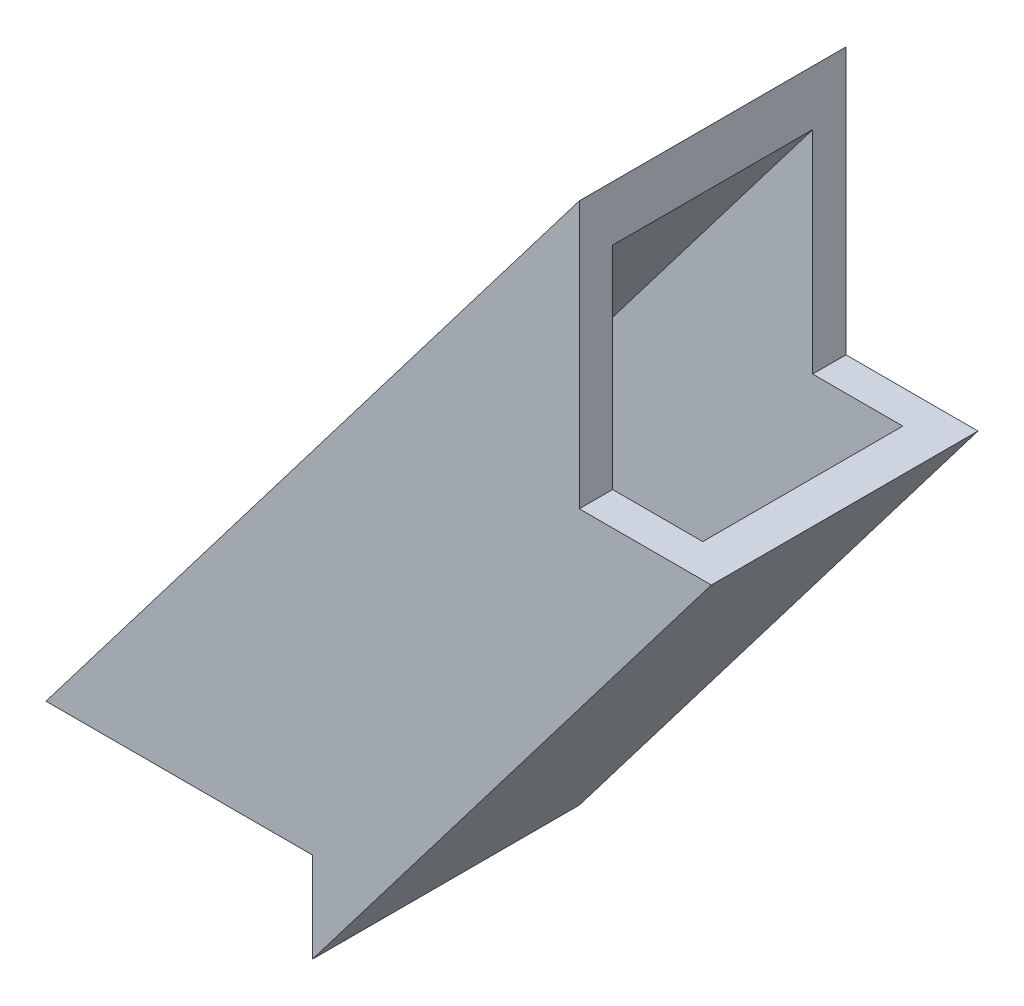
ISO-10303-21;
HEADER;
FILE_DESCRIPTION(('STEP AP214'),'2;1');
FILE_NAME('part.step','',(''),(''),'','','');
FILE_SCHEMA(('AUTOMOTIVE_DESIGN { 1 0 10303 214 1 1 1 1 }'));
ENDSEC;
DATA;
#1=APPLICATION_CONTEXT('core data for automotive mechanical design processes');
#2=APPLICATION_PROTOCOL_DEFINITION('international standard','automotive_design',2000,#1);
#3=PRODUCT_CONTEXT('',#1,'mechanical');
#4=PRODUCT('Part','Part','',(#3));
#5=PRODUCT_RELATED_PRODUCT_CATEGORY('part','',(#4));
#6=PRODUCT_DEFINITION_FORMATION('','',#4);
#7=PRODUCT_DEFINITION_CONTEXT('part definition',#1,'design');
#8=PRODUCT_DEFINITION('design','',#6,#7);
#9=PRODUCT_DEFINITION_SHAPE('','',#8);
#10=(LENGTH_UNIT() NAMED_UNIT(*) SI_UNIT(.MILLI.,.METRE.));
#11=(NAMED_UNIT(*) PLANE_ANGLE_UNIT() SI_UNIT($,.RADIAN.));
#12=(NAMED_UNIT(*) SI_UNIT($,.STERADIAN.) SOLID_ANGLE_UNIT());
#13=UNCERTAINTY_MEASURE_WITH_UNIT(LENGTH_MEASURE(1.E-05),#10,'distance_accuracy_value','');
#14=(GEOMETRIC_REPRESENTATION_CONTEXT(3) GLOBAL_UNCERTAINTY_ASSIGNED_CONTEXT((#13)) GLOBAL_UNIT_ASSIGNED_CONTEXT((#10,
#11,#12)) REPRESENTATION_CONTEXT('',''));
#15=CARTESIAN_POINT('',(0.,0.,0.));
#16=DIRECTION('',(0.,0.,1.));
#17=DIRECTION('',(1.,0.,0.));
#18=AXIS2_PLACEMENT_3D('',#15,#16,#17);
#19=CARTESIAN_POINT('',(317.5,92.075,203.2));
#20=DIRECTION('',(-0.795431720032499,0.606043215262856,0.));
#21=DIRECTION('',(-0.606043215262856,-0.795431720032499,0.));
#22=AXIS2_PLACEMENT_3D('',#19,#20,#21);
#23=PLANE('',#22);
#24=DIRECTION('',(-0.606043215262856,-0.795431720032499,0.));
#25=VECTOR('',#24,1.);
#26=CARTESIAN_POINT('',(317.5,92.075,203.2));
#27=LINE('',#26,#25);
#28=CARTESIAN_POINT('',(317.5,92.075,203.2));
#29=VERTEX_POINT('',#28);
#30=CARTESIAN_POINT('',(266.7,25.4,203.2));
#31=VERTEX_POINT('',#30);
#32=EDGE_CURVE('E136',#29,#31,#27,.T.);
#33=ORIENTED_EDGE('',*,*,#32,.T.);
#34=DIRECTION('',(0.,0.,-1.));
#35=VECTOR('',#34,1.);
#36=CARTESIAN_POINT('',(266.7,25.4,203.2));
#37=LINE('',#36,#35);
#38=CARTESIAN_POINT('',(266.7,25.4,228.6));
#39=VERTEX_POINT('',#38);
#40=EDGE_CURVE('E150',#39,#31,#37,.T.);
#41=ORIENTED_EDGE('',*,*,#40,.F.);
#42=DIRECTION('',(-0.606043215262856,-0.795431720032499,0.));
#43=VECTOR('',#42,1.);
#44=CARTESIAN_POINT('',(317.5,92.075,228.6));
#45=LINE('',#44,#43);
#46=CARTESIAN_POINT('',(317.5,92.075,228.6));
#47=VERTEX_POINT('',#46);
#48=EDGE_CURVE('E144',#47,#39,#45,.T.);
#49=ORIENTED_EDGE('',*,*,#48,.F.);
#50=DIRECTION('',(0.,0.,-1.));
#51=VECTOR('',#50,1.);
#52=CARTESIAN_POINT('',(317.5,92.075,203.2));
#53=LINE('',#52,#51);
#54=EDGE_CURVE('E123',#47,#29,#53,.T.);
#55=ORIENTED_EDGE('',*,*,#54,.T.);
#56=EDGE_LOOP('',(#33,#41,#49,#55));
#57=FACE_BOUND('',#56,.T.);
#58=ADVANCED_FACE('F35',(#57),#23,.T.);
#59=CARTESIAN_POINT('',(337.703965688825,76.6815023323235,203.2));
#60=DIRECTION('',(0.,0.,-1.));
#61=DIRECTION('',(-1.,0.,0.));
#62=AXIS2_PLACEMENT_3D('',#59,#60,#61);
#63=PLANE('',#62);
#64=ORIENTED_EDGE('',*,*,#32,.F.);
#65=DIRECTION('',(0.,-1.,0.));
#66=VECTOR('',#65,1.);
#67=CARTESIAN_POINT('',(317.5,76.6815023323235,203.2));
#68=LINE('',#67,#66);
#69=CARTESIAN_POINT('',(317.5,66.675,203.2));
#70=VERTEX_POINT('',#69);
#71=EDGE_CURVE('E131',#29,#70,#68,.T.);
#72=ORIENTED_EDGE('',*,*,#71,.T.);
#73=DIRECTION('',(1.,0.,0.));
#74=VECTOR('',#73,1.);
#75=CARTESIAN_POINT('',(337.703965688825,66.675,203.2));
#76=LINE('',#75,#74);
#77=CARTESIAN_POINT('',(330.079963911817,66.675,203.2));
#78=VERTEX_POINT('',#77);
#79=EDGE_CURVE('E195',#70,#78,#76,.T.);
#80=ORIENTED_EDGE('',*,*,#79,.T.);
#81=DIRECTION('',(-0.606043215262856,-0.795431720032499,0.));
#82=VECTOR('',#81,1.);
#83=CARTESIAN_POINT('',(337.703965688825,76.6815023323235,203.2));
#84=LINE('',#83,#82);
#85=CARTESIAN_POINT('',(292.1,16.82629736574,203.2));
#86=VERTEX_POINT('',#85);
#87=EDGE_CURVE('E156',#78,#86,#84,.T.);
#88=ORIENTED_EDGE('',*,*,#87,.T.);
#89=DIRECTION('',(0.,1.,0.));
#90=VECTOR('',#89,1.);
#91=CARTESIAN_POINT('',(292.1,76.6815023323235,203.2));
#92=LINE('',#91,#90);
#93=CARTESIAN_POINT('',(292.1,25.4,203.2));
#94=VERTEX_POINT('',#93);
#95=EDGE_CURVE('E201',#86,#94,#92,.T.);
#96=ORIENTED_EDGE('',*,*,#95,.T.);
#97=DIRECTION('',(-1.,0.,0.));
#98=VECTOR('',#97,1.);
#99=CARTESIAN_POINT('',(337.703965688825,25.4,203.2));
#100=LINE('',#99,#98);
#101=EDGE_CURVE('E207',#94,#31,#100,.T.);
#102=ORIENTED_EDGE('',*,*,#101,.T.);
#103=EDGE_LOOP('',(#64,#72,#80,#88,#96,#102));
#104=FACE_BOUND('',#103,.T.);
#105=ADVANCED_FACE('F227',(#104),#63,.T.);
#106=CARTESIAN_POINT('',(337.703965688825,76.6815023323235,203.2));
#107=DIRECTION('',(0.795431720032499,-0.606043215262856,0.));
#108=DIRECTION('',(0.606043215262856,0.795431720032499,0.));
#109=AXIS2_PLACEMENT_3D('',#106,#107,#108);
#110=PLANE('',#109);
#111=ORIENTED_EDGE('',*,*,#87,.F.);
#112=DIRECTION('',(0.,0.,1.));
#113=VECTOR('',#112,1.);
#114=CARTESIAN_POINT('',(330.079963911817,66.675,203.2));
#115=LINE('',#114,#113);
#116=CARTESIAN_POINT('',(330.079963911817,66.675,228.6));
#117=VERTEX_POINT('',#116);
#118=EDGE_CURVE('E192',#78,#117,#115,.T.);
#119=ORIENTED_EDGE('',*,*,#118,.T.);
#120=DIRECTION('',(-0.606043215262856,-0.795431720032499,0.));
#121=VECTOR('',#120,1.);
#122=CARTESIAN_POINT('',(337.703965688825,76.6815023323235,228.6));
#123=LINE('',#122,#121);
#124=CARTESIAN_POINT('',(292.1,16.8262973657399,228.6));
#125=VERTEX_POINT('',#124);
#126=EDGE_CURVE('E152',#117,#125,#123,.T.);
#127=ORIENTED_EDGE('',*,*,#126,.T.);
#128=DIRECTION('',(0.,0.,-1.));
#129=VECTOR('',#128,1.);
#130=CARTESIAN_POINT('',(292.1,16.82629736574,203.2));
#131=LINE('',#130,#129);
#132=EDGE_CURVE('E175',#125,#86,#131,.T.);
#133=ORIENTED_EDGE('',*,*,#132,.T.);
#134=EDGE_LOOP('',(#111,#119,#127,#133));
#135=FACE_BOUND('',#134,.T.);
#136=ADVANCED_FACE('F247',(#135),#110,.T.);
#137=CARTESIAN_POINT('',(337.703965688825,76.6815023323235,228.6));
#138=DIRECTION('',(0.,0.,1.));
#139=DIRECTION('',(1.,0.,0.));
#140=AXIS2_PLACEMENT_3D('',#137,#138,#139);
#141=PLANE('',#140);
#142=DIRECTION('',(1.,0.,0.));
#143=VECTOR('',#142,1.);
#144=CARTESIAN_POINT('',(342.9,66.675,228.6));
#145=LINE('',#144,#143);
#146=CARTESIAN_POINT('',(317.5,66.675,228.6));
#147=VERTEX_POINT('',#146);
#148=EDGE_CURVE('E147',#147,#117,#145,.T.);
#149=ORIENTED_EDGE('',*,*,#148,.F.);
#150=DIRECTION('',(0.,-1.,0.));
#151=VECTOR('',#150,1.);
#152=CARTESIAN_POINT('',(317.5,92.075,228.6));
#153=LINE('',#152,#151);
#154=EDGE_CURVE('E127',#47,#147,#153,.T.);
#155=ORIENTED_EDGE('',*,*,#154,.F.);
#156=ORIENTED_EDGE('',*,*,#48,.T.);
#157=DIRECTION('',(-1.,0.,0.));
#158=VECTOR('',#157,1.);
#159=CARTESIAN_POINT('',(292.1,25.4,228.6));
#160=LINE('',#159,#158);
#161=CARTESIAN_POINT('',(292.1,25.4,228.6));
#162=VERTEX_POINT('',#161);
#163=EDGE_CURVE('E219',#162,#39,#160,.T.);
#164=ORIENTED_EDGE('',*,*,#163,.F.);
#165=DIRECTION('',(0.,1.,0.));
#166=VECTOR('',#165,1.);
#167=CARTESIAN_POINT('',(292.1,-25.4,228.6));
#168=LINE('',#167,#166);
#169=EDGE_CURVE('E221',#125,#162,#168,.T.);
#170=ORIENTED_EDGE('',*,*,#169,.F.);
#171=ORIENTED_EDGE('',*,*,#126,.F.);
#172=EDGE_LOOP('',(#149,#155,#156,#164,#170,#171));
#173=FACE_BOUND('',#172,.T.);
#174=ADVANCED_FACE('F142',(#173),#141,.T.);
#175=CARTESIAN_POINT('',(292.1,-25.4,228.6));
#176=DIRECTION('',(-1.,0.,0.));
#177=DIRECTION('',(0.,0.,1.));
#178=AXIS2_PLACEMENT_3D('',#175,#176,#177);
#179=PLANE('',#178);
#180=ORIENTED_EDGE('',*,*,#169,.T.);
#181=DIRECTION('',(0.,0.,-1.));
#182=VECTOR('',#181,1.);
#183=CARTESIAN_POINT('',(292.1,25.4,228.6));
#184=LINE('',#183,#182);
#185=CARTESIAN_POINT('',(292.1,25.4,225.425));
#186=VERTEX_POINT('',#185);
#187=EDGE_CURVE('E148',#162,#186,#184,.T.);
#188=ORIENTED_EDGE('',*,*,#187,.T.);
#189=DIRECTION('',(0.,-1.,0.));
#190=VECTOR('',#189,1.);
#191=CARTESIAN_POINT('',(292.1,78.6056895407831,225.425));
#192=LINE('',#191,#190);
#193=CARTESIAN_POINT('',(292.1,22.0651976950225,225.425));
#194=VERTEX_POINT('',#193);
#195=EDGE_CURVE('E49',#186,#194,#192,.T.);
#196=ORIENTED_EDGE('',*,*,#195,.T.);
#197=DIRECTION('',(0.,0.,-1.));
#198=VECTOR('',#197,1.);
#199=CARTESIAN_POINT('',(292.1,22.0651976950225,206.375));
#200=LINE('',#199,#198);
#201=CARTESIAN_POINT('',(292.1,22.0651976950225,206.375));
#202=VERTEX_POINT('',#201);
#203=EDGE_CURVE('E151',#194,#202,#200,.T.);
#204=ORIENTED_EDGE('',*,*,#203,.T.);
#205=DIRECTION('',(0.,1.,0.));
#206=VECTOR('',#205,1.);
#207=CARTESIAN_POINT('',(292.1,78.6056895407831,206.375));
#208=LINE('',#207,#206);
#209=CARTESIAN_POINT('',(292.1,25.4,206.375));
#210=VERTEX_POINT('',#209);
#211=EDGE_CURVE('E204',#202,#210,#208,.T.);
#212=ORIENTED_EDGE('',*,*,#211,.T.);
#213=EDGE_CURVE('E218',#210,#94,#184,.T.);
#214=ORIENTED_EDGE('',*,*,#213,.T.);
#215=ORIENTED_EDGE('',*,*,#95,.F.);
#216=ORIENTED_EDGE('',*,*,#132,.F.);
#217=EDGE_LOOP('',(#180,#188,#196,#204,#212,#214,#215,#216));
#218=FACE_BOUND('',#217,.T.);
#219=ADVANCED_FACE('F234',(#218),#179,.T.);
#220=CARTESIAN_POINT('',(292.1,25.4,228.6));
#221=DIRECTION('',(0.,-1.,0.));
#222=DIRECTION('',(0.,0.,-1.));
#223=AXIS2_PLACEMENT_3D('',#220,#221,#222);
#224=PLANE('',#223);
#225=ORIENTED_EDGE('',*,*,#213,.F.);
#226=DIRECTION('',(-1.,0.,0.));
#227=VECTOR('',#226,1.);
#228=CARTESIAN_POINT('',(335.178469977722,25.4,206.375));
#229=LINE('',#228,#227);
#230=CARTESIAN_POINT('',(270.691543108025,25.4,206.375));
#231=VERTEX_POINT('',#230);
#232=EDGE_CURVE('E210',#210,#231,#229,.T.);
#233=ORIENTED_EDGE('',*,*,#232,.T.);
#234=DIRECTION('',(0.,0.,1.));
#235=VECTOR('',#234,1.);
#236=CARTESIAN_POINT('',(270.691543108025,25.4,206.375));
#237=LINE('',#236,#235);
#238=CARTESIAN_POINT('',(270.691543108025,25.4,225.425));
#239=VERTEX_POINT('',#238);
#240=EDGE_CURVE('E212',#231,#239,#237,.T.);
#241=ORIENTED_EDGE('',*,*,#240,.T.);
#242=DIRECTION('',(1.,0.,0.));
#243=VECTOR('',#242,1.);
#244=CARTESIAN_POINT('',(335.178469977722,25.4,225.425));
#245=LINE('',#244,#243);
#246=EDGE_CURVE('E214',#239,#186,#245,.T.);
#247=ORIENTED_EDGE('',*,*,#246,.T.);
#248=ORIENTED_EDGE('',*,*,#187,.F.);
#249=ORIENTED_EDGE('',*,*,#163,.T.);
#250=ORIENTED_EDGE('',*,*,#40,.T.);
#251=ORIENTED_EDGE('',*,*,#101,.F.);
#252=EDGE_LOOP('',(#225,#233,#241,#247,#248,#249,#250,#251));
#253=FACE_BOUND('',#252,.T.);
#254=ADVANCED_FACE('F232',(#253),#224,.T.);
#255=CARTESIAN_POINT('',(335.178469977722,78.6056895407831,206.375));
#256=DIRECTION('',(0.,0.,-1.));
#257=DIRECTION('',(-1.,0.,0.));
#258=AXIS2_PLACEMENT_3D('',#255,#256,#257);
#259=PLANE('',#258);
#260=DIRECTION('',(0.,-1.,0.));
#261=VECTOR('',#260,1.);
#262=CARTESIAN_POINT('',(317.5,78.6056895407831,206.375));
#263=LINE('',#262,#261);
#264=CARTESIAN_POINT('',(317.5,86.8360996707175,206.375));
#265=VERTEX_POINT('',#264);
#266=CARTESIAN_POINT('',(317.5,66.675,206.375));
#267=VERTEX_POINT('',#266);
#268=EDGE_CURVE('E188',#265,#267,#263,.T.);
#269=ORIENTED_EDGE('',*,*,#268,.F.);
#270=DIRECTION('',(-0.606043215262856,-0.795431720032499,0.));
#271=VECTOR('',#270,1.);
#272=CARTESIAN_POINT('',(320.025495711103,90.1508127915405,206.375));
#273=LINE('',#272,#271);
#274=EDGE_CURVE('E137',#265,#231,#273,.T.);
#275=ORIENTED_EDGE('',*,*,#274,.T.);
#276=ORIENTED_EDGE('',*,*,#232,.F.);
#277=ORIENTED_EDGE('',*,*,#211,.F.);
#278=DIRECTION('',(-0.606043215262856,-0.795431720032499,0.));
#279=VECTOR('',#278,1.);
#280=CARTESIAN_POINT('',(335.178469977722,78.6056895407831,206.375));
#281=LINE('',#280,#279);
#282=CARTESIAN_POINT('',(326.088420803792,66.675,206.375));
#283=VERTEX_POINT('',#282);
#284=EDGE_CURVE('E179',#283,#202,#281,.T.);
#285=ORIENTED_EDGE('',*,*,#284,.F.);
#286=DIRECTION('',(1.,0.,0.));
#287=VECTOR('',#286,1.);
#288=CARTESIAN_POINT('',(335.178469977722,66.675,206.375));
#289=LINE('',#288,#287);
#290=EDGE_CURVE('E57',#267,#283,#289,.T.);
#291=ORIENTED_EDGE('',*,*,#290,.F.);
#292=EDGE_LOOP('',(#269,#275,#276,#277,#285,#291));
#293=FACE_BOUND('',#292,.T.);
#294=ADVANCED_FACE('F237',(#293),#259,.F.);
#295=CARTESIAN_POINT('',(320.025495711103,90.1508127915405,206.375));
#296=DIRECTION('',(-0.795431720032499,0.606043215262856,0.));
#297=DIRECTION('',(-0.606043215262856,-0.795431720032499,0.));
#298=AXIS2_PLACEMENT_3D('',#295,#296,#297);
#299=PLANE('',#298);
#300=DIRECTION('',(0.,0.,-1.));
#301=VECTOR('',#300,1.);
#302=CARTESIAN_POINT('',(317.5,86.8360996707175,206.375));
#303=LINE('',#302,#301);
#304=CARTESIAN_POINT('',(317.5,86.8360996707175,225.425));
#305=VERTEX_POINT('',#304);
#306=EDGE_CURVE('E190',#305,#265,#303,.T.);
#307=ORIENTED_EDGE('',*,*,#306,.F.);
#308=DIRECTION('',(-0.606043215262856,-0.795431720032499,0.));
#309=VECTOR('',#308,1.);
#310=CARTESIAN_POINT('',(320.025495711103,90.1508127915405,225.425));
#311=LINE('',#310,#309);
#312=EDGE_CURVE('E178',#305,#239,#311,.T.);
#313=ORIENTED_EDGE('',*,*,#312,.T.);
#314=ORIENTED_EDGE('',*,*,#240,.F.);
#315=ORIENTED_EDGE('',*,*,#274,.F.);
#316=EDGE_LOOP('',(#307,#313,#314,#315));
#317=FACE_BOUND('',#316,.T.);
#318=ADVANCED_FACE('F243',(#317),#299,.F.);
#319=CARTESIAN_POINT('',(335.178469977722,78.6056895407831,225.425));
#320=DIRECTION('',(0.,0.,1.));
#321=DIRECTION('',(1.,0.,0.));
#322=AXIS2_PLACEMENT_3D('',#319,#320,#321);
#323=PLANE('',#322);
#324=DIRECTION('',(0.,1.,0.));
#325=VECTOR('',#324,1.);
#326=CARTESIAN_POINT('',(317.5,78.6056895407831,225.425));
#327=LINE('',#326,#325);
#328=CARTESIAN_POINT('',(317.5,66.675,225.425));
#329=VERTEX_POINT('',#328);
#330=EDGE_CURVE('E11',#329,#305,#327,.T.);
#331=ORIENTED_EDGE('',*,*,#330,.F.);
#332=DIRECTION('',(-1.,0.,0.));
#333=VECTOR('',#332,1.);
#334=CARTESIAN_POINT('',(335.178469977722,66.675,225.425));
#335=LINE('',#334,#333);
#336=CARTESIAN_POINT('',(326.088420803792,66.675,225.425));
#337=VERTEX_POINT('',#336);
#338=EDGE_CURVE('E164',#337,#329,#335,.T.);
#339=ORIENTED_EDGE('',*,*,#338,.F.);
#340=DIRECTION('',(-0.606043215262856,-0.795431720032499,0.));
#341=VECTOR('',#340,1.);
#342=CARTESIAN_POINT('',(335.178469977722,78.6056895407831,225.425));
#343=LINE('',#342,#341);
#344=EDGE_CURVE('E173',#337,#194,#343,.T.);
#345=ORIENTED_EDGE('',*,*,#344,.T.);
#346=ORIENTED_EDGE('',*,*,#195,.F.);
#347=ORIENTED_EDGE('',*,*,#246,.F.);
#348=ORIENTED_EDGE('',*,*,#312,.F.);
#349=EDGE_LOOP('',(#331,#339,#345,#346,#347,#348));
#350=FACE_BOUND('',#349,.T.);
#351=ADVANCED_FACE('F172',(#350),#323,.F.);
#352=CARTESIAN_POINT('',(335.178469977722,78.6056895407831,206.375));
#353=DIRECTION('',(0.795431720032499,-0.606043215262856,0.));
#354=DIRECTION('',(0.606043215262856,0.795431720032499,0.));
#355=AXIS2_PLACEMENT_3D('',#352,#353,#354);
#356=PLANE('',#355);
#357=DIRECTION('',(0.,0.,1.));
#358=VECTOR('',#357,1.);
#359=CARTESIAN_POINT('',(326.088420803792,66.675,206.375));
#360=LINE('',#359,#358);
#361=EDGE_CURVE('E42',#283,#337,#360,.T.);
#362=ORIENTED_EDGE('',*,*,#361,.F.);
#363=ORIENTED_EDGE('',*,*,#284,.T.);
#364=ORIENTED_EDGE('',*,*,#203,.F.);
#365=ORIENTED_EDGE('',*,*,#344,.F.);
#366=EDGE_LOOP('',(#362,#363,#364,#365));
#367=FACE_BOUND('',#366,.T.);
#368=ADVANCED_FACE('F177',(#367),#356,.F.);
#369=CARTESIAN_POINT('',(317.5,92.075,228.6));
#370=DIRECTION('',(1.,0.,0.));
#371=DIRECTION('',(0.,0.,-1.));
#372=AXIS2_PLACEMENT_3D('',#369,#370,#371);
#373=PLANE('',#372);
#374=ORIENTED_EDGE('',*,*,#54,.F.);
#375=ORIENTED_EDGE('',*,*,#154,.T.);
#376=DIRECTION('',(0.,0.,-1.));
#377=VECTOR('',#376,1.);
#378=CARTESIAN_POINT('',(317.5,66.675,228.6));
#379=LINE('',#378,#377);
#380=EDGE_CURVE('E216',#147,#329,#379,.T.);
#381=ORIENTED_EDGE('',*,*,#380,.T.);
#382=ORIENTED_EDGE('',*,*,#330,.T.);
#383=ORIENTED_EDGE('',*,*,#306,.T.);
#384=ORIENTED_EDGE('',*,*,#268,.T.);
#385=EDGE_CURVE('E224',#267,#70,#379,.T.);
#386=ORIENTED_EDGE('',*,*,#385,.T.);
#387=ORIENTED_EDGE('',*,*,#71,.F.);
#388=EDGE_LOOP('',(#374,#375,#381,#382,#383,#384,#386,#387));
#389=FACE_BOUND('',#388,.T.);
#390=ADVANCED_FACE('F125',(#389),#373,.T.);
#391=CARTESIAN_POINT('',(342.9,66.675,228.6));
#392=DIRECTION('',(0.,1.,0.));
#393=DIRECTION('',(0.,0.,1.));
#394=AXIS2_PLACEMENT_3D('',#391,#392,#393);
#395=PLANE('',#394);
#396=ORIENTED_EDGE('',*,*,#79,.F.);
#397=ORIENTED_EDGE('',*,*,#385,.F.);
#398=ORIENTED_EDGE('',*,*,#290,.T.);
#399=ORIENTED_EDGE('',*,*,#361,.T.);
#400=ORIENTED_EDGE('',*,*,#338,.T.);
#401=ORIENTED_EDGE('',*,*,#380,.F.);
#402=ORIENTED_EDGE('',*,*,#148,.T.);
#403=ORIENTED_EDGE('',*,*,#118,.F.);
#404=EDGE_LOOP('',(#396,#397,#398,#399,#400,#401,#402,#403));
#405=FACE_BOUND('',#404,.T.);
#406=ADVANCED_FACE('F163',(#405),#395,.T.);
#407=CLOSED_SHELL('',(#58,#105,#136,#174,#219,#254,#294,#318,#351,#368,#390,#406));
#408=MANIFOLD_SOLID_BREP('B2',#407);
#409=ADVANCED_BREP_SHAPE_REPRESENTATION('',(#18,#408),#14);
#410=SHAPE_DEFINITION_REPRESENTATION(#9,#409);
ENDSEC;
END-ISO-10303-21;
